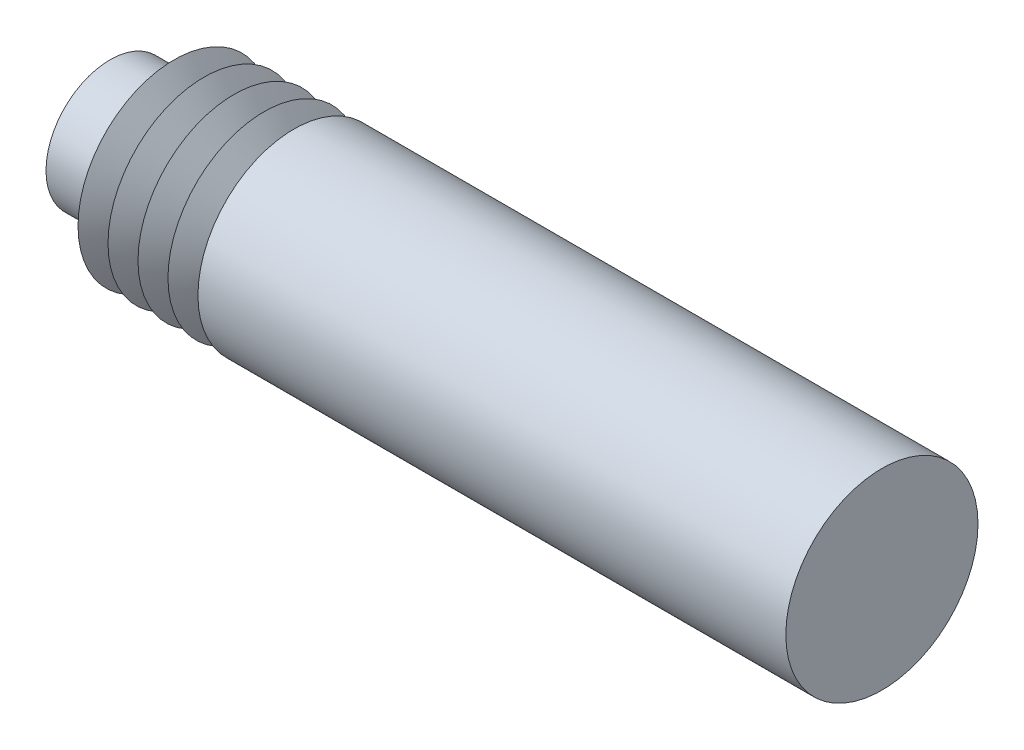
ISO-10303-21;
HEADER;
FILE_DESCRIPTION(('STEP AP214'),'2;1');
FILE_NAME('part.step','',(''),(''),'','','');
FILE_SCHEMA(('AUTOMOTIVE_DESIGN { 1 0 10303 214 1 1 1 1 }'));
ENDSEC;
DATA;
#1=APPLICATION_CONTEXT('core data for automotive mechanical design processes');
#2=APPLICATION_PROTOCOL_DEFINITION('international standard','automotive_design',2000,#1);
#3=PRODUCT_CONTEXT('',#1,'mechanical');
#4=PRODUCT('Part','Part','',(#3));
#5=PRODUCT_RELATED_PRODUCT_CATEGORY('part','',(#4));
#6=PRODUCT_DEFINITION_FORMATION('','',#4);
#7=PRODUCT_DEFINITION_CONTEXT('part definition',#1,'design');
#8=PRODUCT_DEFINITION('design','',#6,#7);
#9=PRODUCT_DEFINITION_SHAPE('','',#8);
#10=(LENGTH_UNIT() NAMED_UNIT(*) SI_UNIT(.MILLI.,.METRE.));
#11=(NAMED_UNIT(*) PLANE_ANGLE_UNIT() SI_UNIT($,.RADIAN.));
#12=(NAMED_UNIT(*) SI_UNIT($,.STERADIAN.) SOLID_ANGLE_UNIT());
#13=UNCERTAINTY_MEASURE_WITH_UNIT(LENGTH_MEASURE(1.E-05),#10,'distance_accuracy_value','');
#14=(GEOMETRIC_REPRESENTATION_CONTEXT(3) GLOBAL_UNCERTAINTY_ASSIGNED_CONTEXT((#13)) GLOBAL_UNIT_ASSIGNED_CONTEXT((#10,
#11,#12)) REPRESENTATION_CONTEXT('',''));
#15=CARTESIAN_POINT('',(0.,0.,0.));
#16=DIRECTION('',(0.,0.,1.));
#17=DIRECTION('',(1.,0.,0.));
#18=AXIS2_PLACEMENT_3D('',#15,#16,#17);
#19=CARTESIAN_POINT('',(-25.125,5.,0.));
#20=DIRECTION('',(1.,0.,0.));
#21=DIRECTION('',(0.,0.,-1.));
#22=AXIS2_PLACEMENT_3D('',#19,#20,#21);
#23=PLANE('',#22);
#24=CARTESIAN_POINT('',(-25.125,0.,0.));
#25=DIRECTION('',(-1.,0.,0.));
#26=DIRECTION('',(0.,0.,1.));
#27=AXIS2_PLACEMENT_3D('',#24,#25,#26);
#28=CIRCLE('',#27,5.);
#29=CARTESIAN_POINT('',(-25.125,0.,5.));
#30=VERTEX_POINT('',#29);
#31=EDGE_CURVE('E77',#30,#30,#28,.T.);
#32=ORIENTED_EDGE('',*,*,#31,.F.);
#33=EDGE_LOOP('',(#32));
#34=FACE_BOUND('',#33,.T.);
#35=CARTESIAN_POINT('',(-25.125,0.,0.));
#36=DIRECTION('',(-1.,0.,0.));
#37=DIRECTION('',(0.,0.,1.));
#38=AXIS2_PLACEMENT_3D('',#35,#36,#37);
#39=CIRCLE('',#38,7.5);
#40=CARTESIAN_POINT('',(-25.125,0.,7.5));
#41=VERTEX_POINT('',#40);
#42=EDGE_CURVE('E10',#41,#41,#39,.T.);
#43=ORIENTED_EDGE('',*,*,#42,.T.);
#44=EDGE_LOOP('',(#43));
#45=FACE_BOUND('',#44,.T.);
#46=ADVANCED_FACE('F31',(#34,#45),#23,.F.);
#47=CARTESIAN_POINT('',(-23.955,0.,0.));
#48=DIRECTION('',(-1.,0.,0.));
#49=DIRECTION('',(0.,0.,1.));
#50=AXIS2_PLACEMENT_3D('',#47,#48,#49);
#51=CONICAL_SURFACE('',#50,5.7,0.994421106203712);
#52=ORIENTED_EDGE('',*,*,#42,.F.);
#53=EDGE_LOOP('',(#52));
#54=FACE_BOUND('',#53,.T.);
#55=CARTESIAN_POINT('',(-23.955,0.,0.));
#56=DIRECTION('',(-1.,0.,0.));
#57=DIRECTION('',(0.,0.,1.));
#58=AXIS2_PLACEMENT_3D('',#55,#56,#57);
#59=CIRCLE('',#58,5.7);
#60=CARTESIAN_POINT('',(-23.955,0.,5.7));
#61=VERTEX_POINT('',#60);
#62=EDGE_CURVE('E37',#61,#61,#59,.T.);
#63=ORIENTED_EDGE('',*,*,#62,.T.);
#64=EDGE_LOOP('',(#63));
#65=FACE_BOUND('',#64,.T.);
#66=ADVANCED_FACE('F84',(#54,#65),#51,.T.);
#67=CARTESIAN_POINT('',(-22.785,0.,0.));
#68=DIRECTION('',(1.,0.,0.));
#69=DIRECTION('',(0.,0.,-1.));
#70=AXIS2_PLACEMENT_3D('',#67,#68,#69);
#71=CONICAL_SURFACE('',#70,7.5,0.994421106203713);
#72=ORIENTED_EDGE('',*,*,#62,.F.);
#73=EDGE_LOOP('',(#72));
#74=FACE_BOUND('',#73,.T.);
#75=CARTESIAN_POINT('',(-22.785,0.,0.));
#76=DIRECTION('',(-1.,0.,0.));
#77=DIRECTION('',(0.,0.,1.));
#78=AXIS2_PLACEMENT_3D('',#75,#76,#77);
#79=CIRCLE('',#78,7.5);
#80=CARTESIAN_POINT('',(-22.785,0.,7.5));
#81=VERTEX_POINT('',#80);
#82=EDGE_CURVE('E41',#81,#81,#79,.T.);
#83=ORIENTED_EDGE('',*,*,#82,.T.);
#84=EDGE_LOOP('',(#83));
#85=FACE_BOUND('',#84,.T.);
#86=ADVANCED_FACE('F88',(#74,#85),#71,.T.);
#87=CARTESIAN_POINT('',(-21.615,0.,0.));
#88=DIRECTION('',(-1.,0.,0.));
#89=DIRECTION('',(0.,0.,1.));
#90=AXIS2_PLACEMENT_3D('',#87,#88,#89);
#91=CONICAL_SURFACE('',#90,5.7,0.994421106203712);
#92=ORIENTED_EDGE('',*,*,#82,.F.);
#93=EDGE_LOOP('',(#92));
#94=FACE_BOUND('',#93,.T.);
#95=CARTESIAN_POINT('',(-21.615,0.,0.));
#96=DIRECTION('',(-1.,0.,0.));
#97=DIRECTION('',(0.,0.,1.));
#98=AXIS2_PLACEMENT_3D('',#95,#96,#97);
#99=CIRCLE('',#98,5.7);
#100=CARTESIAN_POINT('',(-21.615,0.,5.7));
#101=VERTEX_POINT('',#100);
#102=EDGE_CURVE('E45',#101,#101,#99,.T.);
#103=ORIENTED_EDGE('',*,*,#102,.T.);
#104=EDGE_LOOP('',(#103));
#105=FACE_BOUND('',#104,.T.);
#106=ADVANCED_FACE('F93',(#94,#105),#91,.T.);
#107=CARTESIAN_POINT('',(-20.445,0.,0.));
#108=DIRECTION('',(1.,0.,0.));
#109=DIRECTION('',(0.,0.,-1.));
#110=AXIS2_PLACEMENT_3D('',#107,#108,#109);
#111=CONICAL_SURFACE('',#110,7.5,0.994421106203712);
#112=ORIENTED_EDGE('',*,*,#102,.F.);
#113=EDGE_LOOP('',(#112));
#114=FACE_BOUND('',#113,.T.);
#115=CARTESIAN_POINT('',(-20.445,0.,0.));
#116=DIRECTION('',(-1.,0.,0.));
#117=DIRECTION('',(0.,0.,1.));
#118=AXIS2_PLACEMENT_3D('',#115,#116,#117);
#119=CIRCLE('',#118,7.5);
#120=CARTESIAN_POINT('',(-20.445,0.,7.5));
#121=VERTEX_POINT('',#120);
#122=EDGE_CURVE('E50',#121,#121,#119,.T.);
#123=ORIENTED_EDGE('',*,*,#122,.T.);
#124=EDGE_LOOP('',(#123));
#125=FACE_BOUND('',#124,.T.);
#126=ADVANCED_FACE('F99',(#114,#125),#111,.T.);
#127=CARTESIAN_POINT('',(-19.275,0.,0.));
#128=DIRECTION('',(-1.,0.,0.));
#129=DIRECTION('',(0.,0.,1.));
#130=AXIS2_PLACEMENT_3D('',#127,#128,#129);
#131=CONICAL_SURFACE('',#130,5.7,0.994421106203711);
#132=ORIENTED_EDGE('',*,*,#122,.F.);
#133=EDGE_LOOP('',(#132));
#134=FACE_BOUND('',#133,.T.);
#135=CARTESIAN_POINT('',(-19.275,0.,0.));
#136=DIRECTION('',(-1.,0.,0.));
#137=DIRECTION('',(0.,0.,1.));
#138=AXIS2_PLACEMENT_3D('',#135,#136,#137);
#139=CIRCLE('',#138,5.7);
#140=CARTESIAN_POINT('',(-19.275,0.,5.7));
#141=VERTEX_POINT('',#140);
#142=EDGE_CURVE('E53',#141,#141,#139,.T.);
#143=ORIENTED_EDGE('',*,*,#142,.T.);
#144=EDGE_LOOP('',(#143));
#145=FACE_BOUND('',#144,.T.);
#146=ADVANCED_FACE('F103',(#134,#145),#131,.T.);
#147=CARTESIAN_POINT('',(-18.105,0.,0.));
#148=DIRECTION('',(1.,0.,0.));
#149=DIRECTION('',(0.,0.,-1.));
#150=AXIS2_PLACEMENT_3D('',#147,#148,#149);
#151=CONICAL_SURFACE('',#150,7.5,0.994421106203713);
#152=ORIENTED_EDGE('',*,*,#142,.F.);
#153=EDGE_LOOP('',(#152));
#154=FACE_BOUND('',#153,.T.);
#155=CARTESIAN_POINT('',(-18.105,0.,0.));
#156=DIRECTION('',(-1.,0.,0.));
#157=DIRECTION('',(0.,0.,1.));
#158=AXIS2_PLACEMENT_3D('',#155,#156,#157);
#159=CIRCLE('',#158,7.5);
#160=CARTESIAN_POINT('',(-18.105,0.,7.5));
#161=VERTEX_POINT('',#160);
#162=EDGE_CURVE('E56',#161,#161,#159,.T.);
#163=ORIENTED_EDGE('',*,*,#162,.T.);
#164=EDGE_LOOP('',(#163));
#165=FACE_BOUND('',#164,.T.);
#166=ADVANCED_FACE('F107',(#154,#165),#151,.T.);
#167=CARTESIAN_POINT('',(-16.935,0.,0.));
#168=DIRECTION('',(-1.,0.,0.));
#169=DIRECTION('',(0.,0.,1.));
#170=AXIS2_PLACEMENT_3D('',#167,#168,#169);
#171=CONICAL_SURFACE('',#170,5.7,0.994421106203712);
#172=ORIENTED_EDGE('',*,*,#162,.F.);
#173=EDGE_LOOP('',(#172));
#174=FACE_BOUND('',#173,.T.);
#175=CARTESIAN_POINT('',(-16.935,0.,0.));
#176=DIRECTION('',(-1.,0.,0.));
#177=DIRECTION('',(0.,0.,1.));
#178=AXIS2_PLACEMENT_3D('',#175,#176,#177);
#179=CIRCLE('',#178,5.7);
#180=CARTESIAN_POINT('',(-16.935,0.,5.7));
#181=VERTEX_POINT('',#180);
#182=EDGE_CURVE('E59',#181,#181,#179,.T.);
#183=ORIENTED_EDGE('',*,*,#182,.T.);
#184=EDGE_LOOP('',(#183));
#185=FACE_BOUND('',#184,.T.);
#186=ADVANCED_FACE('F111',(#174,#185),#171,.T.);
#187=CARTESIAN_POINT('',(-15.765,0.,0.));
#188=DIRECTION('',(1.,0.,0.));
#189=DIRECTION('',(0.,0.,-1.));
#190=AXIS2_PLACEMENT_3D('',#187,#188,#189);
#191=CONICAL_SURFACE('',#190,7.5,0.994421106203712);
#192=ORIENTED_EDGE('',*,*,#182,.F.);
#193=EDGE_LOOP('',(#192));
#194=FACE_BOUND('',#193,.T.);
#195=CARTESIAN_POINT('',(-15.765,0.,0.));
#196=DIRECTION('',(-1.,0.,0.));
#197=DIRECTION('',(0.,0.,1.));
#198=AXIS2_PLACEMENT_3D('',#195,#196,#197);
#199=CIRCLE('',#198,7.5);
#200=CARTESIAN_POINT('',(-15.765,0.,7.5));
#201=VERTEX_POINT('',#200);
#202=EDGE_CURVE('E62',#201,#201,#199,.T.);
#203=ORIENTED_EDGE('',*,*,#202,.T.);
#204=EDGE_LOOP('',(#203));
#205=FACE_BOUND('',#204,.T.);
#206=ADVANCED_FACE('F115',(#194,#205),#191,.T.);
#207=CARTESIAN_POINT('',(0.,0.,0.));
#208=DIRECTION('',(-1.,0.,0.));
#209=DIRECTION('',(0.,0.,1.));
#210=AXIS2_PLACEMENT_3D('',#207,#208,#209);
#211=CYLINDRICAL_SURFACE('',#210,7.5);
#212=ORIENTED_EDGE('',*,*,#202,.F.);
#213=EDGE_LOOP('',(#212));
#214=FACE_BOUND('',#213,.T.);
#215=CARTESIAN_POINT('',(30.125,0.,0.));
#216=DIRECTION('',(-1.,0.,0.));
#217=DIRECTION('',(0.,0.,1.));
#218=AXIS2_PLACEMENT_3D('',#215,#216,#217);
#219=CIRCLE('',#218,7.5);
#220=CARTESIAN_POINT('',(30.125,0.,7.5));
#221=VERTEX_POINT('',#220);
#222=EDGE_CURVE('E65',#221,#221,#219,.T.);
#223=ORIENTED_EDGE('',*,*,#222,.T.);
#224=EDGE_LOOP('',(#223));
#225=FACE_BOUND('',#224,.T.);
#226=ADVANCED_FACE('F119',(#214,#225),#211,.T.);
#227=CARTESIAN_POINT('',(30.125,7.5,0.));
#228=DIRECTION('',(-1.,0.,0.));
#229=DIRECTION('',(0.,0.,1.));
#230=AXIS2_PLACEMENT_3D('',#227,#228,#229);
#231=PLANE('',#230);
#232=ORIENTED_EDGE('',*,*,#222,.F.);
#233=EDGE_LOOP('',(#232));
#234=FACE_BOUND('',#233,.T.);
#235=ADVANCED_FACE('F123',(#234),#231,.F.);
#236=CARTESIAN_POINT('',(-15.245,0.,0.));
#237=DIRECTION('',(1.,0.,0.));
#238=DIRECTION('',(0.,0.,-1.));
#239=AXIS2_PLACEMENT_3D('',#236,#237,#238);
#240=PLANE('',#239);
#241=CARTESIAN_POINT('',(-15.245,0.,0.));
#242=DIRECTION('',(-1.,0.,0.));
#243=DIRECTION('',(0.,0.,1.));
#244=AXIS2_PLACEMENT_3D('',#241,#242,#243);
#245=CIRCLE('',#244,2.5);
#246=CARTESIAN_POINT('',(-15.245,0.,2.5));
#247=VERTEX_POINT('',#246);
#248=EDGE_CURVE('E68',#247,#247,#245,.T.);
#249=ORIENTED_EDGE('',*,*,#248,.T.);
#250=EDGE_LOOP('',(#249));
#251=FACE_BOUND('',#250,.T.);
#252=ADVANCED_FACE('F127',(#251),#240,.F.);
#253=CARTESIAN_POINT('',(0.,0.,0.));
#254=DIRECTION('',(-1.,0.,0.));
#255=DIRECTION('',(0.,0.,1.));
#256=AXIS2_PLACEMENT_3D('',#253,#254,#255);
#257=CYLINDRICAL_SURFACE('',#256,2.5);
#258=ORIENTED_EDGE('',*,*,#248,.F.);
#259=EDGE_LOOP('',(#258));
#260=FACE_BOUND('',#259,.T.);
#261=CARTESIAN_POINT('',(-30.125,0.,0.));
#262=DIRECTION('',(-1.,0.,0.));
#263=DIRECTION('',(0.,0.,1.));
#264=AXIS2_PLACEMENT_3D('',#261,#262,#263);
#265=CIRCLE('',#264,2.5);
#266=CARTESIAN_POINT('',(-30.125,0.,2.5));
#267=VERTEX_POINT('',#266);
#268=EDGE_CURVE('E71',#267,#267,#265,.T.);
#269=ORIENTED_EDGE('',*,*,#268,.T.);
#270=EDGE_LOOP('',(#269));
#271=FACE_BOUND('',#270,.T.);
#272=ADVANCED_FACE('F131',(#260,#271),#257,.F.);
#273=CARTESIAN_POINT('',(-30.125,2.5,0.));
#274=DIRECTION('',(1.,0.,0.));
#275=DIRECTION('',(0.,0.,-1.));
#276=AXIS2_PLACEMENT_3D('',#273,#274,#275);
#277=PLANE('',#276);
#278=ORIENTED_EDGE('',*,*,#268,.F.);
#279=EDGE_LOOP('',(#278));
#280=FACE_BOUND('',#279,.T.);
#281=CARTESIAN_POINT('',(-30.125,0.,0.));
#282=DIRECTION('',(-1.,0.,0.));
#283=DIRECTION('',(0.,0.,1.));
#284=AXIS2_PLACEMENT_3D('',#281,#282,#283);
#285=CIRCLE('',#284,5.);
#286=CARTESIAN_POINT('',(-30.125,0.,5.));
#287=VERTEX_POINT('',#286);
#288=EDGE_CURVE('E74',#287,#287,#285,.T.);
#289=ORIENTED_EDGE('',*,*,#288,.T.);
#290=EDGE_LOOP('',(#289));
#291=FACE_BOUND('',#290,.T.);
#292=ADVANCED_FACE('F135',(#280,#291),#277,.F.);
#293=CARTESIAN_POINT('',(0.,0.,0.));
#294=DIRECTION('',(-1.,0.,0.));
#295=DIRECTION('',(0.,0.,1.));
#296=AXIS2_PLACEMENT_3D('',#293,#294,#295);
#297=CYLINDRICAL_SURFACE('',#296,5.);
#298=ORIENTED_EDGE('',*,*,#288,.F.);
#299=EDGE_LOOP('',(#298));
#300=FACE_BOUND('',#299,.T.);
#301=ORIENTED_EDGE('',*,*,#31,.T.);
#302=EDGE_LOOP('',(#301));
#303=FACE_BOUND('',#302,.T.);
#304=ADVANCED_FACE('F81',(#300,#303),#297,.T.);
#305=CLOSED_SHELL('',(#46,#66,#86,#106,#126,#146,#166,#186,#206,#226,#235,#252,#272,#292,#304));
#306=MANIFOLD_SOLID_BREP('B2',#305);
#307=ADVANCED_BREP_SHAPE_REPRESENTATION('',(#18,#306),#14);
#308=SHAPE_DEFINITION_REPRESENTATION(#9,#307);
ENDSEC;
END-ISO-10303-21;
